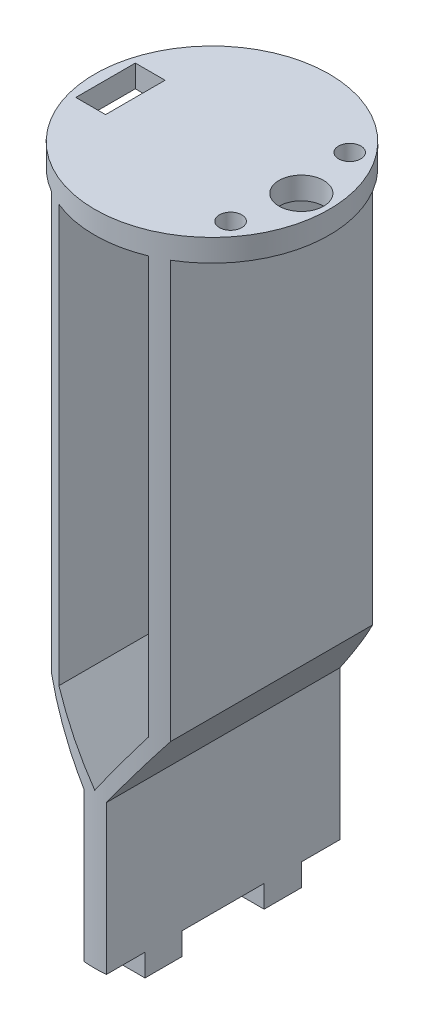
ISO-10303-21;
HEADER;
FILE_DESCRIPTION(('STEP AP214'),'2;1');
FILE_NAME('part.step','',(''),(''),'','','');
FILE_SCHEMA(('AUTOMOTIVE_DESIGN { 1 0 10303 214 1 1 1 1 }'));
ENDSEC;
DATA;
#1=APPLICATION_CONTEXT('core data for automotive mechanical design processes');
#2=APPLICATION_PROTOCOL_DEFINITION('international standard','automotive_design',2000,#1);
#3=PRODUCT_CONTEXT('',#1,'mechanical');
#4=PRODUCT('Part','Part','',(#3));
#5=PRODUCT_RELATED_PRODUCT_CATEGORY('part','',(#4));
#6=PRODUCT_DEFINITION_FORMATION('','',#4);
#7=PRODUCT_DEFINITION_CONTEXT('part definition',#1,'design');
#8=PRODUCT_DEFINITION('design','',#6,#7);
#9=PRODUCT_DEFINITION_SHAPE('','',#8);
#10=(LENGTH_UNIT() NAMED_UNIT(*) SI_UNIT(.MILLI.,.METRE.));
#11=(NAMED_UNIT(*) PLANE_ANGLE_UNIT() SI_UNIT($,.RADIAN.));
#12=(NAMED_UNIT(*) SI_UNIT($,.STERADIAN.) SOLID_ANGLE_UNIT());
#13=UNCERTAINTY_MEASURE_WITH_UNIT(LENGTH_MEASURE(1.E-05),#10,'distance_accuracy_value','');
#14=(GEOMETRIC_REPRESENTATION_CONTEXT(3) GLOBAL_UNCERTAINTY_ASSIGNED_CONTEXT((#13)) GLOBAL_UNIT_ASSIGNED_CONTEXT((#10,
#11,#12)) REPRESENTATION_CONTEXT('',''));
#15=CARTESIAN_POINT('',(0.,0.,0.));
#16=DIRECTION('',(0.,0.,1.));
#17=DIRECTION('',(1.,0.,0.));
#18=AXIS2_PLACEMENT_3D('',#15,#16,#17);
#19=CARTESIAN_POINT('',(0.,-20.,33.));
#20=DIRECTION('',(0.,1.,0.));
#21=DIRECTION('',(0.,0.,1.));
#22=AXIS2_PLACEMENT_3D('',#19,#20,#21);
#23=PLANE('',#22);
#24=DIRECTION('',(0.,0.,-1.));
#25=VECTOR('',#24,1.);
#26=CARTESIAN_POINT('',(0.,-20.,33.));
#27=LINE('',#26,#25);
#28=CARTESIAN_POINT('',(0.,-20.,6.));
#29=VERTEX_POINT('',#28);
#30=CARTESIAN_POINT('',(0.,-20.,0.821591279724847));
#31=VERTEX_POINT('',#30);
#32=EDGE_CURVE('E269',#29,#31,#27,.T.);
#33=ORIENTED_EDGE('',*,*,#32,.T.);
#34=CARTESIAN_POINT('',(1.5,-20.,16.5));
#35=DIRECTION('',(0.,1.,0.));
#36=DIRECTION('',(0.,0.,1.));
#37=AXIS2_PLACEMENT_3D('',#34,#35,#36);
#38=CIRCLE('',#37,15.75);
#39=CARTESIAN_POINT('',(3.,-20.,0.821591279724844));
#40=VERTEX_POINT('',#39);
#41=EDGE_CURVE('E489',#31,#40,#38,.F.);
#42=ORIENTED_EDGE('',*,*,#41,.T.);
#43=DIRECTION('',(0.,0.,-1.));
#44=VECTOR('',#43,1.);
#45=CARTESIAN_POINT('',(3.,-20.,33.));
#46=LINE('',#45,#44);
#47=CARTESIAN_POINT('',(3.,-20.,6.));
#48=VERTEX_POINT('',#47);
#49=EDGE_CURVE('E253',#48,#40,#46,.T.);
#50=ORIENTED_EDGE('',*,*,#49,.F.);
#51=DIRECTION('',(1.,0.,0.));
#52=VECTOR('',#51,1.);
#53=CARTESIAN_POINT('',(0.,-20.,6.));
#54=LINE('',#53,#52);
#55=EDGE_CURVE('E453',#29,#48,#54,.T.);
#56=ORIENTED_EDGE('',*,*,#55,.F.);
#57=EDGE_LOOP('',(#33,#42,#50,#56));
#58=FACE_BOUND('',#57,.T.);
#59=ADVANCED_FACE('F49',(#58),#23,.F.);
#60=DIRECTION('',(-1.,0.,0.));
#61=VECTOR('',#60,1.);
#62=CARTESIAN_POINT('',(0.,-20.,11.));
#63=LINE('',#62,#61);
#64=CARTESIAN_POINT('',(3.,-20.,11.));
#65=VERTEX_POINT('',#64);
#66=CARTESIAN_POINT('',(0.,-20.,11.));
#67=VERTEX_POINT('',#66);
#68=EDGE_CURVE('E295',#65,#67,#63,.T.);
#69=ORIENTED_EDGE('',*,*,#68,.F.);
#70=CARTESIAN_POINT('',(3.,-20.,22.));
#71=VERTEX_POINT('',#70);
#72=EDGE_CURVE('E260',#71,#65,#46,.T.);
#73=ORIENTED_EDGE('',*,*,#72,.F.);
#74=DIRECTION('',(1.,0.,0.));
#75=VECTOR('',#74,1.);
#76=CARTESIAN_POINT('',(3.,-20.,22.));
#77=LINE('',#76,#75);
#78=CARTESIAN_POINT('',(0.,-20.,22.));
#79=VERTEX_POINT('',#78);
#80=EDGE_CURVE('E293',#79,#71,#77,.T.);
#81=ORIENTED_EDGE('',*,*,#80,.F.);
#82=EDGE_CURVE('E271',#79,#67,#27,.T.);
#83=ORIENTED_EDGE('',*,*,#82,.T.);
#84=EDGE_LOOP('',(#69,#73,#81,#83));
#85=FACE_BOUND('',#84,.T.);
#86=ADVANCED_FACE('F291',(#85),#23,.F.);
#87=CARTESIAN_POINT('',(3.,-20.,32.1784087202752));
#88=VERTEX_POINT('',#87);
#89=CARTESIAN_POINT('',(3.,-20.,27.));
#90=VERTEX_POINT('',#89);
#91=EDGE_CURVE('E272',#88,#90,#46,.T.);
#92=ORIENTED_EDGE('',*,*,#91,.F.);
#93=CARTESIAN_POINT('',(1.5,-20.,16.5));
#94=DIRECTION('',(0.,1.,0.));
#95=DIRECTION('',(0.,0.,1.));
#96=AXIS2_PLACEMENT_3D('',#93,#94,#95);
#97=CIRCLE('',#96,15.75);
#98=CARTESIAN_POINT('',(0.,-20.,32.1784087202752));
#99=VERTEX_POINT('',#98);
#100=EDGE_CURVE('E414',#88,#99,#97,.F.);
#101=ORIENTED_EDGE('',*,*,#100,.T.);
#102=CARTESIAN_POINT('',(0.,-20.,27.));
#103=VERTEX_POINT('',#102);
#104=EDGE_CURVE('E53',#99,#103,#27,.T.);
#105=ORIENTED_EDGE('',*,*,#104,.T.);
#106=DIRECTION('',(-1.,0.,0.));
#107=VECTOR('',#106,1.);
#108=CARTESIAN_POINT('',(3.,-20.,27.));
#109=LINE('',#108,#107);
#110=EDGE_CURVE('E303',#90,#103,#109,.T.);
#111=ORIENTED_EDGE('',*,*,#110,.F.);
#112=EDGE_LOOP('',(#92,#101,#105,#111));
#113=FACE_BOUND('',#112,.T.);
#114=ADVANCED_FACE('F400',(#113),#23,.F.);
#115=CARTESIAN_POINT('',(-6.50000000000001,0.,33.));
#116=DIRECTION('',(1.,0.,0.));
#117=DIRECTION('',(0.,0.,-1.));
#118=AXIS2_PLACEMENT_3D('',#115,#116,#117);
#119=PLANE('',#118);
#120=DIRECTION('',(0.,0.,-1.));
#121=VECTOR('',#120,1.);
#122=CARTESIAN_POINT('',(-6.50000000000001,9.28571428571426,33.));
#123=LINE('',#122,#121);
#124=CARTESIAN_POINT('',(-6.50000000000001,9.28571428571426,30.0669635512151));
#125=VERTEX_POINT('',#124);
#126=CARTESIAN_POINT('',(-6.50000000000001,9.28571428571426,2.93303644878487));
#127=VERTEX_POINT('',#126);
#128=EDGE_CURVE('E59',#125,#127,#123,.T.);
#129=ORIENTED_EDGE('',*,*,#128,.F.);
#130=DIRECTION('',(0.,-1.,0.));
#131=VECTOR('',#130,1.);
#132=CARTESIAN_POINT('',(-6.50000000000001,98.2857142857142,30.0669635512151));
#133=LINE('',#132,#131);
#134=CARTESIAN_POINT('',(-6.50000000000001,65.2857142857142,30.0669635512151));
#135=VERTEX_POINT('',#134);
#136=EDGE_CURVE('E220',#125,#135,#133,.F.);
#137=ORIENTED_EDGE('',*,*,#136,.T.);
#138=DIRECTION('',(0.,0.,1.));
#139=VECTOR('',#138,1.);
#140=CARTESIAN_POINT('',(-6.50000000000001,65.2857142857142,33.));
#141=LINE('',#140,#139);
#142=CARTESIAN_POINT('',(-6.50000000000001,65.2857142857142,2.93303644878487));
#143=VERTEX_POINT('',#142);
#144=EDGE_CURVE('E230',#143,#135,#141,.T.);
#145=ORIENTED_EDGE('',*,*,#144,.F.);
#146=DIRECTION('',(0.,-1.,0.));
#147=VECTOR('',#146,1.);
#148=CARTESIAN_POINT('',(-6.50000000000001,98.2857142857142,2.93303644878487));
#149=LINE('',#148,#147);
#150=EDGE_CURVE('E223',#143,#127,#149,.T.);
#151=ORIENTED_EDGE('',*,*,#150,.T.);
#152=EDGE_LOOP('',(#129,#137,#145,#151));
#153=FACE_BOUND('',#152,.T.);
#154=ADVANCED_FACE('F229',(#153),#119,.F.);
#155=CARTESIAN_POINT('',(0.,0.,33.));
#156=DIRECTION('',(0.819231920519039,0.57346234436333,0.));
#157=DIRECTION('',(-0.57346234436333,0.819231920519039,0.));
#158=AXIS2_PLACEMENT_3D('',#155,#156,#157);
#159=PLANE('',#158);
#160=DIRECTION('',(0.,0.,-1.));
#161=VECTOR('',#160,1.);
#162=CARTESIAN_POINT('',(0.,0.,33.));
#163=LINE('',#162,#161);
#164=CARTESIAN_POINT('',(0.,0.,32.1784087202752));
#165=VERTEX_POINT('',#164);
#166=CARTESIAN_POINT('',(0.,0.,0.821591279724851));
#167=VERTEX_POINT('',#166);
#168=EDGE_CURVE('E425',#165,#167,#163,.T.);
#169=ORIENTED_EDGE('',*,*,#168,.F.);
#170=CARTESIAN_POINT('',(1.5,-2.14285714285714,16.5));
#171=DIRECTION('',(0.819231920519039,0.57346234436333,0.));
#172=DIRECTION('',(0.57346234436333,-0.819231920519039,0.));
#173=AXIS2_PLACEMENT_3D('',#170,#171,#172);
#174=ELLIPSE('',#173,27.4647501354007,15.75);
#175=EDGE_CURVE('E497',#165,#125,#174,.F.);
#176=ORIENTED_EDGE('',*,*,#175,.T.);
#177=ORIENTED_EDGE('',*,*,#128,.T.);
#178=EDGE_CURVE('E232',#127,#167,#174,.F.);
#179=ORIENTED_EDGE('',*,*,#178,.T.);
#180=EDGE_LOOP('',(#169,#176,#177,#179));
#181=FACE_BOUND('',#180,.T.);
#182=ADVANCED_FACE('F411',(#181),#159,.F.);
#183=CARTESIAN_POINT('',(0.,0.,33.));
#184=DIRECTION('',(1.,0.,0.));
#185=DIRECTION('',(0.,1.,0.));
#186=AXIS2_PLACEMENT_3D('',#183,#184,#185);
#187=PLANE('',#186);
#188=ORIENTED_EDGE('',*,*,#104,.F.);
#189=DIRECTION('',(0.,-1.,0.));
#190=VECTOR('',#189,1.);
#191=CARTESIAN_POINT('',(0.,98.2857142857142,32.1784087202752));
#192=LINE('',#191,#190);
#193=EDGE_CURVE('E493',#99,#165,#192,.F.);
#194=ORIENTED_EDGE('',*,*,#193,.T.);
#195=ORIENTED_EDGE('',*,*,#168,.T.);
#196=DIRECTION('',(0.,-1.,0.));
#197=VECTOR('',#196,1.);
#198=CARTESIAN_POINT('',(0.,98.2857142857142,0.821591279724847));
#199=LINE('',#198,#197);
#200=EDGE_CURVE('E495',#167,#31,#199,.T.);
#201=ORIENTED_EDGE('',*,*,#200,.T.);
#202=ORIENTED_EDGE('',*,*,#32,.F.);
#203=DIRECTION('',(0.,1.,0.));
#204=VECTOR('',#203,1.);
#205=CARTESIAN_POINT('',(0.,-23.,6.));
#206=LINE('',#205,#204);
#207=CARTESIAN_POINT('',(0.,-23.,6.));
#208=VERTEX_POINT('',#207);
#209=EDGE_CURVE('E309',#208,#29,#206,.T.);
#210=ORIENTED_EDGE('',*,*,#209,.F.);
#211=DIRECTION('',(0.,0.,-1.));
#212=VECTOR('',#211,1.);
#213=CARTESIAN_POINT('',(0.,-23.,11.));
#214=LINE('',#213,#212);
#215=CARTESIAN_POINT('',(0.,-23.,11.));
#216=VERTEX_POINT('',#215);
#217=EDGE_CURVE('E517',#216,#208,#214,.T.);
#218=ORIENTED_EDGE('',*,*,#217,.F.);
#219=DIRECTION('',(0.,1.,0.));
#220=VECTOR('',#219,1.);
#221=CARTESIAN_POINT('',(0.,-23.,11.));
#222=LINE('',#221,#220);
#223=EDGE_CURVE('E513',#216,#67,#222,.T.);
#224=ORIENTED_EDGE('',*,*,#223,.T.);
#225=ORIENTED_EDGE('',*,*,#82,.F.);
#226=DIRECTION('',(0.,1.,0.));
#227=VECTOR('',#226,1.);
#228=CARTESIAN_POINT('',(0.,-23.,22.));
#229=LINE('',#228,#227);
#230=CARTESIAN_POINT('',(0.,-23.,22.));
#231=VERTEX_POINT('',#230);
#232=EDGE_CURVE('E301',#231,#79,#229,.T.);
#233=ORIENTED_EDGE('',*,*,#232,.F.);
#234=DIRECTION('',(0.,0.,-1.));
#235=VECTOR('',#234,1.);
#236=CARTESIAN_POINT('',(0.,-23.,22.));
#237=LINE('',#236,#235);
#238=CARTESIAN_POINT('',(0.,-23.,27.));
#239=VERTEX_POINT('',#238);
#240=EDGE_CURVE('E503',#239,#231,#237,.T.);
#241=ORIENTED_EDGE('',*,*,#240,.F.);
#242=DIRECTION('',(0.,1.,0.));
#243=VECTOR('',#242,1.);
#244=CARTESIAN_POINT('',(0.,-23.,27.));
#245=LINE('',#244,#243);
#246=EDGE_CURVE('E421',#239,#103,#245,.T.);
#247=ORIENTED_EDGE('',*,*,#246,.T.);
#248=EDGE_LOOP('',(#188,#194,#195,#201,#202,#210,#218,#224,#225,#233,#241,#247));
#249=FACE_BOUND('',#248,.T.);
#250=ADVANCED_FACE('F501',(#249),#187,.F.);
#251=CARTESIAN_POINT('',(3.,0.,33.));
#252=DIRECTION('',(1.,0.,0.));
#253=DIRECTION('',(0.,1.,0.));
#254=AXIS2_PLACEMENT_3D('',#251,#252,#253);
#255=PLANE('',#254);
#256=DIRECTION('',(0.,-1.,0.));
#257=VECTOR('',#256,1.);
#258=CARTESIAN_POINT('',(2.99999999999999,98.2857142857142,32.1784087202752));
#259=LINE('',#258,#257);
#260=CARTESIAN_POINT('',(2.99999999999999,0.,32.1784087202752));
#261=VERTEX_POINT('',#260);
#262=EDGE_CURVE('E485',#88,#261,#259,.F.);
#263=ORIENTED_EDGE('',*,*,#262,.F.);
#264=ORIENTED_EDGE('',*,*,#91,.T.);
#265=DIRECTION('',(0.,1.,0.));
#266=VECTOR('',#265,1.);
#267=CARTESIAN_POINT('',(3.,-23.,27.));
#268=LINE('',#267,#266);
#269=CARTESIAN_POINT('',(3.,-23.,27.));
#270=VERTEX_POINT('',#269);
#271=EDGE_CURVE('E329',#270,#90,#268,.T.);
#272=ORIENTED_EDGE('',*,*,#271,.F.);
#273=DIRECTION('',(0.,0.,1.));
#274=VECTOR('',#273,1.);
#275=CARTESIAN_POINT('',(3.,-23.,22.));
#276=LINE('',#275,#274);
#277=CARTESIAN_POINT('',(3.,-23.,22.));
#278=VERTEX_POINT('',#277);
#279=EDGE_CURVE('E302',#278,#270,#276,.T.);
#280=ORIENTED_EDGE('',*,*,#279,.F.);
#281=DIRECTION('',(0.,1.,0.));
#282=VECTOR('',#281,1.);
#283=CARTESIAN_POINT('',(3.,-23.,22.));
#284=LINE('',#283,#282);
#285=EDGE_CURVE('E287',#278,#71,#284,.T.);
#286=ORIENTED_EDGE('',*,*,#285,.T.);
#287=ORIENTED_EDGE('',*,*,#72,.T.);
#288=DIRECTION('',(0.,1.,0.));
#289=VECTOR('',#288,1.);
#290=CARTESIAN_POINT('',(3.,-23.,11.));
#291=LINE('',#290,#289);
#292=CARTESIAN_POINT('',(3.,-23.,11.));
#293=VERTEX_POINT('',#292);
#294=EDGE_CURVE('E283',#293,#65,#291,.T.);
#295=ORIENTED_EDGE('',*,*,#294,.F.);
#296=DIRECTION('',(0.,0.,1.));
#297=VECTOR('',#296,1.);
#298=CARTESIAN_POINT('',(3.,-23.,11.));
#299=LINE('',#298,#297);
#300=CARTESIAN_POINT('',(3.,-23.,6.));
#301=VERTEX_POINT('',#300);
#302=EDGE_CURVE('E520',#301,#293,#299,.T.);
#303=ORIENTED_EDGE('',*,*,#302,.F.);
#304=DIRECTION('',(0.,1.,0.));
#305=VECTOR('',#304,1.);
#306=CARTESIAN_POINT('',(3.,-23.,6.));
#307=LINE('',#306,#305);
#308=EDGE_CURVE('E510',#301,#48,#307,.T.);
#309=ORIENTED_EDGE('',*,*,#308,.T.);
#310=ORIENTED_EDGE('',*,*,#49,.T.);
#311=DIRECTION('',(0.,-1.,0.));
#312=VECTOR('',#311,1.);
#313=CARTESIAN_POINT('',(2.99999999999999,98.2857142857142,0.821591279724844));
#314=LINE('',#313,#312);
#315=CARTESIAN_POINT('',(2.99999999999999,0.,0.821591279724844));
#316=VERTEX_POINT('',#315);
#317=EDGE_CURVE('E487',#316,#40,#314,.T.);
#318=ORIENTED_EDGE('',*,*,#317,.F.);
#319=DIRECTION('',(0.,0.,-1.));
#320=VECTOR('',#319,1.);
#321=CARTESIAN_POINT('',(3.,0.,33.));
#322=LINE('',#321,#320);
#323=EDGE_CURVE('E249',#261,#316,#322,.T.);
#324=ORIENTED_EDGE('',*,*,#323,.F.);
#325=EDGE_LOOP('',(#263,#264,#272,#280,#286,#287,#295,#303,#309,#310,#318,#324));
#326=FACE_BOUND('',#325,.T.);
#327=ADVANCED_FACE('F281',(#326),#255,.T.);
#328=CARTESIAN_POINT('',(2.01342281879194,-1.40939597315436,33.));
#329=DIRECTION('',(-0.81923192051904,0.573462344363329,0.));
#330=DIRECTION('',(-0.573462344363329,-0.81923192051904,0.));
#331=AXIS2_PLACEMENT_3D('',#328,#329,#330);
#332=PLANE('',#331);
#333=ORIENTED_EDGE('',*,*,#323,.T.);
#334=CARTESIAN_POINT('',(1.5,-2.14285714285713,16.5));
#335=DIRECTION('',(-0.81923192051904,0.573462344363329,0.));
#336=DIRECTION('',(-0.573462344363329,-0.81923192051904,0.));
#337=AXIS2_PLACEMENT_3D('',#334,#335,#336);
#338=ELLIPSE('',#337,27.4647501354008,15.75);
#339=CARTESIAN_POINT('',(9.49999999999999,9.28571428571426,2.93303644878486));
#340=VERTEX_POINT('',#339);
#341=EDGE_CURVE('E481',#316,#340,#338,.F.);
#342=ORIENTED_EDGE('',*,*,#341,.T.);
#343=DIRECTION('',(0.,0.,-1.));
#344=VECTOR('',#343,1.);
#345=CARTESIAN_POINT('',(9.49999999999999,9.28571428571426,33.));
#346=LINE('',#345,#344);
#347=CARTESIAN_POINT('',(9.49999999999999,9.28571428571426,30.0669635512151));
#348=VERTEX_POINT('',#347);
#349=EDGE_CURVE('E246',#348,#340,#346,.T.);
#350=ORIENTED_EDGE('',*,*,#349,.F.);
#351=EDGE_CURVE('E482',#348,#261,#338,.F.);
#352=ORIENTED_EDGE('',*,*,#351,.T.);
#353=EDGE_LOOP('',(#333,#342,#350,#352));
#354=FACE_BOUND('',#353,.T.);
#355=ADVANCED_FACE('F593',(#354),#332,.F.);
#356=CARTESIAN_POINT('',(9.49999999999999,0.,33.));
#357=DIRECTION('',(-1.,0.,0.));
#358=DIRECTION('',(0.,0.,1.));
#359=AXIS2_PLACEMENT_3D('',#356,#357,#358);
#360=PLANE('',#359);
#361=ORIENTED_EDGE('',*,*,#349,.T.);
#362=DIRECTION('',(0.,-1.,0.));
#363=VECTOR('',#362,1.);
#364=CARTESIAN_POINT('',(9.49999999999999,98.2857142857142,2.93303644878486));
#365=LINE('',#364,#363);
#366=CARTESIAN_POINT('',(9.49999999999999,65.2857142857142,2.93303644878486));
#367=VERTEX_POINT('',#366);
#368=EDGE_CURVE('E475',#340,#367,#365,.F.);
#369=ORIENTED_EDGE('',*,*,#368,.T.);
#370=DIRECTION('',(0.,0.,-1.));
#371=VECTOR('',#370,1.);
#372=CARTESIAN_POINT('',(9.49999999999999,65.2857142857142,33.));
#373=LINE('',#372,#371);
#374=CARTESIAN_POINT('',(9.49999999999999,65.2857142857142,30.0669635512151));
#375=VERTEX_POINT('',#374);
#376=EDGE_CURVE('E236',#375,#367,#373,.T.);
#377=ORIENTED_EDGE('',*,*,#376,.F.);
#378=DIRECTION('',(0.,-1.,0.));
#379=VECTOR('',#378,1.);
#380=CARTESIAN_POINT('',(9.49999999999999,98.2857142857142,30.0669635512151));
#381=LINE('',#380,#379);
#382=EDGE_CURVE('E478',#375,#348,#381,.T.);
#383=ORIENTED_EDGE('',*,*,#382,.T.);
#384=EDGE_LOOP('',(#361,#369,#377,#383));
#385=FACE_BOUND('',#384,.T.);
#386=ADVANCED_FACE('F588',(#385),#360,.F.);
#387=CARTESIAN_POINT('',(0.,68.2857142857142,33.));
#388=DIRECTION('',(0.,-1.,0.));
#389=DIRECTION('',(0.,0.,-1.));
#390=AXIS2_PLACEMENT_3D('',#387,#388,#389);
#391=PLANE('',#390);
#392=CARTESIAN_POINT('',(1.5,68.2857142857142,16.5));
#393=DIRECTION('',(0.,-1.,0.));
#394=DIRECTION('',(0.,0.,-1.));
#395=AXIS2_PLACEMENT_3D('',#392,#393,#394);
#396=CIRCLE('',#395,15.75);
#397=CARTESIAN_POINT('',(1.5,68.2857142857142,0.750000000000001));
#398=VERTEX_POINT('',#397);
#399=EDGE_CURVE('E469',#398,#398,#396,.F.);
#400=ORIENTED_EDGE('',*,*,#399,.T.);
#401=EDGE_LOOP('',(#400));
#402=FACE_BOUND('',#401,.T.);
#403=CARTESIAN_POINT('',(12.,68.2857142857142,24.5));
#404=DIRECTION('',(0.,-1.,0.));
#405=DIRECTION('',(0.,0.,1.));
#406=AXIS2_PLACEMENT_3D('',#403,#404,#405);
#407=CIRCLE('',#406,1.5);
#408=CARTESIAN_POINT('',(12.,68.2857142857142,26.));
#409=VERTEX_POINT('',#408);
#410=EDGE_CURVE('E322',#409,#409,#407,.T.);
#411=ORIENTED_EDGE('',*,*,#410,.T.);
#412=EDGE_LOOP('',(#411));
#413=FACE_BOUND('',#412,.T.);
#414=CARTESIAN_POINT('',(12.,68.2857142857142,8.5));
#415=DIRECTION('',(0.,-1.,0.));
#416=DIRECTION('',(0.,0.,-1.));
#417=AXIS2_PLACEMENT_3D('',#414,#415,#416);
#418=CIRCLE('',#417,1.5);
#419=CARTESIAN_POINT('',(12.,68.2857142857142,7.));
#420=VERTEX_POINT('',#419);
#421=EDGE_CURVE('E330',#420,#420,#418,.T.);
#422=ORIENTED_EDGE('',*,*,#421,.T.);
#423=EDGE_LOOP('',(#422));
#424=FACE_BOUND('',#423,.T.);
#425=CARTESIAN_POINT('',(13.5,68.2857142857142,16.5));
#426=DIRECTION('',(0.,-1.,0.));
#427=DIRECTION('',(0.,0.,-1.));
#428=AXIS2_PLACEMENT_3D('',#425,#426,#427);
#429=CIRCLE('',#428,3.);
#430=CARTESIAN_POINT('',(13.5,68.2857142857142,13.5));
#431=VERTEX_POINT('',#430);
#432=EDGE_CURVE('E336',#431,#431,#429,.T.);
#433=ORIENTED_EDGE('',*,*,#432,.T.);
#434=EDGE_LOOP('',(#433));
#435=FACE_BOUND('',#434,.T.);
#436=DIRECTION('',(-1.,0.,0.));
#437=VECTOR('',#436,1.);
#438=CARTESIAN_POINT('',(-12.8,68.2857142857142,20.5));
#439=LINE('',#438,#437);
#440=CARTESIAN_POINT('',(-8.80000000000001,68.2857142857142,20.5));
#441=VERTEX_POINT('',#440);
#442=CARTESIAN_POINT('',(-12.8,68.2857142857142,20.5));
#443=VERTEX_POINT('',#442);
#444=EDGE_CURVE('E352',#441,#443,#439,.T.);
#445=ORIENTED_EDGE('',*,*,#444,.T.);
#446=DIRECTION('',(0.,0.,-1.));
#447=VECTOR('',#446,1.);
#448=CARTESIAN_POINT('',(-12.8,68.2857142857142,12.5));
#449=LINE('',#448,#447);
#450=CARTESIAN_POINT('',(-12.8,68.2857142857142,12.5));
#451=VERTEX_POINT('',#450);
#452=EDGE_CURVE('E342',#443,#451,#449,.T.);
#453=ORIENTED_EDGE('',*,*,#452,.T.);
#454=DIRECTION('',(1.,0.,0.));
#455=VECTOR('',#454,1.);
#456=CARTESIAN_POINT('',(-8.80000000000001,68.2857142857142,12.5));
#457=LINE('',#456,#455);
#458=CARTESIAN_POINT('',(-8.80000000000001,68.2857142857142,12.5));
#459=VERTEX_POINT('',#458);
#460=EDGE_CURVE('E345',#451,#459,#457,.T.);
#461=ORIENTED_EDGE('',*,*,#460,.T.);
#462=DIRECTION('',(0.,0.,1.));
#463=VECTOR('',#462,1.);
#464=CARTESIAN_POINT('',(-8.80000000000001,68.2857142857142,20.5));
#465=LINE('',#464,#463);
#466=EDGE_CURVE('E349',#459,#441,#465,.T.);
#467=ORIENTED_EDGE('',*,*,#466,.T.);
#468=EDGE_LOOP('',(#445,#453,#461,#467));
#469=FACE_BOUND('',#468,.T.);
#470=ADVANCED_FACE('F386',(#402,#413,#424,#435,#469),#391,.F.);
#471=CARTESIAN_POINT('',(1.5,65.2857142857142,16.5));
#472=DIRECTION('',(0.,1.,0.));
#473=DIRECTION('',(0.,0.,1.));
#474=AXIS2_PLACEMENT_3D('',#471,#472,#473);
#475=PLANE('',#474);
#476=CARTESIAN_POINT('',(12.,65.2857142857142,24.5));
#477=DIRECTION('',(0.,-1.,0.));
#478=DIRECTION('',(0.,0.,1.));
#479=AXIS2_PLACEMENT_3D('',#476,#477,#478);
#480=CIRCLE('',#479,1.5);
#481=CARTESIAN_POINT('',(12.,65.2857142857142,26.));
#482=VERTEX_POINT('',#481);
#483=EDGE_CURVE('E326',#482,#482,#480,.T.);
#484=ORIENTED_EDGE('',*,*,#483,.F.);
#485=EDGE_LOOP('',(#484));
#486=FACE_BOUND('',#485,.T.);
#487=CARTESIAN_POINT('',(12.,65.2857142857142,8.5));
#488=DIRECTION('',(0.,-1.,0.));
#489=DIRECTION('',(0.,0.,-1.));
#490=AXIS2_PLACEMENT_3D('',#487,#488,#489);
#491=CIRCLE('',#490,1.5);
#492=CARTESIAN_POINT('',(12.,65.2857142857142,7.));
#493=VERTEX_POINT('',#492);
#494=EDGE_CURVE('E325',#493,#493,#491,.T.);
#495=ORIENTED_EDGE('',*,*,#494,.F.);
#496=EDGE_LOOP('',(#495));
#497=FACE_BOUND('',#496,.T.);
#498=CARTESIAN_POINT('',(13.5,65.2857142857142,16.5));
#499=DIRECTION('',(0.,-1.,0.));
#500=DIRECTION('',(0.,0.,-1.));
#501=AXIS2_PLACEMENT_3D('',#498,#499,#500);
#502=CIRCLE('',#501,3.);
#503=CARTESIAN_POINT('',(13.5,65.2857142857142,13.5));
#504=VERTEX_POINT('',#503);
#505=EDGE_CURVE('E333',#504,#504,#502,.T.);
#506=ORIENTED_EDGE('',*,*,#505,.F.);
#507=EDGE_LOOP('',(#506));
#508=FACE_BOUND('',#507,.T.);
#509=ORIENTED_EDGE('',*,*,#376,.T.);
#510=CARTESIAN_POINT('',(1.5,65.2857142857142,16.5));
#511=DIRECTION('',(0.,1.,0.));
#512=DIRECTION('',(0.,0.,1.));
#513=AXIS2_PLACEMENT_3D('',#510,#511,#512);
#514=CIRCLE('',#513,15.75);
#515=EDGE_CURVE('E472',#367,#375,#514,.F.);
#516=ORIENTED_EDGE('',*,*,#515,.T.);
#517=EDGE_LOOP('',(#509,#516));
#518=FACE_BOUND('',#517,.T.);
#519=ADVANCED_FACE('F581',(#486,#497,#508,#518),#475,.F.);
#520=DIRECTION('',(1.,0.,0.));
#521=VECTOR('',#520,1.);
#522=CARTESIAN_POINT('',(-8.80000000000001,65.2857142857142,12.5));
#523=LINE('',#522,#521);
#524=CARTESIAN_POINT('',(-12.8,65.2857142857142,12.5));
#525=VERTEX_POINT('',#524);
#526=CARTESIAN_POINT('',(-8.80000000000001,65.2857142857142,12.5));
#527=VERTEX_POINT('',#526);
#528=EDGE_CURVE('E339',#525,#527,#523,.T.);
#529=ORIENTED_EDGE('',*,*,#528,.F.);
#530=DIRECTION('',(0.,0.,-1.));
#531=VECTOR('',#530,1.);
#532=CARTESIAN_POINT('',(-12.8,65.2857142857142,16.5));
#533=LINE('',#532,#531);
#534=CARTESIAN_POINT('',(-12.8,65.2857142857142,20.5));
#535=VERTEX_POINT('',#534);
#536=EDGE_CURVE('E346',#535,#525,#533,.T.);
#537=ORIENTED_EDGE('',*,*,#536,.F.);
#538=DIRECTION('',(-1.,0.,0.));
#539=VECTOR('',#538,1.);
#540=CARTESIAN_POINT('',(-12.8,65.2857142857142,20.5));
#541=LINE('',#540,#539);
#542=CARTESIAN_POINT('',(-8.80000000000001,65.2857142857142,20.5));
#543=VERTEX_POINT('',#542);
#544=EDGE_CURVE('E361',#543,#535,#541,.T.);
#545=ORIENTED_EDGE('',*,*,#544,.F.);
#546=DIRECTION('',(0.,0.,1.));
#547=VECTOR('',#546,1.);
#548=CARTESIAN_POINT('',(-8.80000000000001,65.2857142857142,20.5));
#549=LINE('',#548,#547);
#550=EDGE_CURVE('E358',#527,#543,#549,.T.);
#551=ORIENTED_EDGE('',*,*,#550,.F.);
#552=EDGE_LOOP('',(#529,#537,#545,#551));
#553=FACE_BOUND('',#552,.T.);
#554=ORIENTED_EDGE('',*,*,#144,.T.);
#555=CARTESIAN_POINT('',(1.5,65.2857142857142,16.5));
#556=DIRECTION('',(0.,1.,0.));
#557=DIRECTION('',(0.,0.,1.));
#558=AXIS2_PLACEMENT_3D('',#555,#556,#557);
#559=CIRCLE('',#558,15.75);
#560=EDGE_CURVE('E12',#135,#143,#559,.F.);
#561=ORIENTED_EDGE('',*,*,#560,.T.);
#562=EDGE_LOOP('',(#554,#561));
#563=FACE_BOUND('',#562,.T.);
#564=ADVANCED_FACE('F234',(#553,#563),#475,.F.);
#565=CARTESIAN_POINT('',(-12.8,68.2857142857142,16.5));
#566=DIRECTION('',(-1.,0.,0.));
#567=DIRECTION('',(0.,0.,1.));
#568=AXIS2_PLACEMENT_3D('',#565,#566,#567);
#569=PLANE('',#568);
#570=ORIENTED_EDGE('',*,*,#536,.T.);
#571=DIRECTION('',(0.,-1.,0.));
#572=VECTOR('',#571,1.);
#573=CARTESIAN_POINT('',(-12.8,68.2857142857142,12.5));
#574=LINE('',#573,#572);
#575=EDGE_CURVE('E355',#451,#525,#574,.T.);
#576=ORIENTED_EDGE('',*,*,#575,.F.);
#577=ORIENTED_EDGE('',*,*,#452,.F.);
#578=DIRECTION('',(0.,-1.,0.));
#579=VECTOR('',#578,1.);
#580=CARTESIAN_POINT('',(-12.8,68.2857142857142,20.5));
#581=LINE('',#580,#579);
#582=EDGE_CURVE('E242',#443,#535,#581,.T.);
#583=ORIENTED_EDGE('',*,*,#582,.T.);
#584=EDGE_LOOP('',(#570,#576,#577,#583));
#585=FACE_BOUND('',#584,.T.);
#586=ADVANCED_FACE('F378',(#585),#569,.F.);
#587=CARTESIAN_POINT('',(-12.8,68.2857142857142,20.5));
#588=DIRECTION('',(0.,0.,1.));
#589=DIRECTION('',(1.,0.,0.));
#590=AXIS2_PLACEMENT_3D('',#587,#588,#589);
#591=PLANE('',#590);
#592=ORIENTED_EDGE('',*,*,#544,.T.);
#593=ORIENTED_EDGE('',*,*,#582,.F.);
#594=ORIENTED_EDGE('',*,*,#444,.F.);
#595=DIRECTION('',(0.,-1.,0.));
#596=VECTOR('',#595,1.);
#597=CARTESIAN_POINT('',(-8.80000000000001,68.2857142857142,20.5));
#598=LINE('',#597,#596);
#599=EDGE_CURVE('E367',#441,#543,#598,.T.);
#600=ORIENTED_EDGE('',*,*,#599,.T.);
#601=EDGE_LOOP('',(#592,#593,#594,#600));
#602=FACE_BOUND('',#601,.T.);
#603=ADVANCED_FACE('F388',(#602),#591,.F.);
#604=CARTESIAN_POINT('',(-8.80000000000001,68.2857142857142,20.5));
#605=DIRECTION('',(1.,0.,0.));
#606=DIRECTION('',(0.,0.,-1.));
#607=AXIS2_PLACEMENT_3D('',#604,#605,#606);
#608=PLANE('',#607);
#609=ORIENTED_EDGE('',*,*,#550,.T.);
#610=ORIENTED_EDGE('',*,*,#599,.F.);
#611=ORIENTED_EDGE('',*,*,#466,.F.);
#612=DIRECTION('',(0.,-1.,0.));
#613=VECTOR('',#612,1.);
#614=CARTESIAN_POINT('',(-8.80000000000001,68.2857142857142,12.5));
#615=LINE('',#614,#613);
#616=EDGE_CURVE('E369',#459,#527,#615,.T.);
#617=ORIENTED_EDGE('',*,*,#616,.T.);
#618=EDGE_LOOP('',(#609,#610,#611,#617));
#619=FACE_BOUND('',#618,.T.);
#620=ADVANCED_FACE('F383',(#619),#608,.F.);
#621=CARTESIAN_POINT('',(-8.80000000000001,68.2857142857142,12.5));
#622=DIRECTION('',(0.,0.,-1.));
#623=DIRECTION('',(-1.,0.,0.));
#624=AXIS2_PLACEMENT_3D('',#621,#622,#623);
#625=PLANE('',#624);
#626=ORIENTED_EDGE('',*,*,#528,.T.);
#627=ORIENTED_EDGE('',*,*,#616,.F.);
#628=ORIENTED_EDGE('',*,*,#460,.F.);
#629=ORIENTED_EDGE('',*,*,#575,.T.);
#630=EDGE_LOOP('',(#626,#627,#628,#629));
#631=FACE_BOUND('',#630,.T.);
#632=ADVANCED_FACE('F372',(#631),#625,.F.);
#633=CARTESIAN_POINT('',(13.5,68.2857142857142,16.5));
#634=DIRECTION('',(0.,-1.,0.));
#635=DIRECTION('',(0.,0.,-1.));
#636=AXIS2_PLACEMENT_3D('',#633,#634,#635);
#637=CYLINDRICAL_SURFACE('',#636,3.);
#638=ORIENTED_EDGE('',*,*,#432,.F.);
#639=EDGE_LOOP('',(#638));
#640=FACE_BOUND('',#639,.T.);
#641=ORIENTED_EDGE('',*,*,#505,.T.);
#642=EDGE_LOOP('',(#641));
#643=FACE_BOUND('',#642,.T.);
#644=ADVANCED_FACE('F569',(#640,#643),#637,.F.);
#645=CARTESIAN_POINT('',(12.,68.2857142857142,8.5));
#646=DIRECTION('',(0.,-1.,0.));
#647=DIRECTION('',(0.,0.,-1.));
#648=AXIS2_PLACEMENT_3D('',#645,#646,#647);
#649=CYLINDRICAL_SURFACE('',#648,1.5);
#650=ORIENTED_EDGE('',*,*,#421,.F.);
#651=EDGE_LOOP('',(#650));
#652=FACE_BOUND('',#651,.T.);
#653=ORIENTED_EDGE('',*,*,#494,.T.);
#654=EDGE_LOOP('',(#653));
#655=FACE_BOUND('',#654,.T.);
#656=ADVANCED_FACE('F565',(#652,#655),#649,.F.);
#657=CARTESIAN_POINT('',(12.,68.2857142857142,24.5));
#658=DIRECTION('',(0.,-1.,0.));
#659=DIRECTION('',(0.,0.,-1.));
#660=AXIS2_PLACEMENT_3D('',#657,#658,#659);
#661=CYLINDRICAL_SURFACE('',#660,1.5);
#662=ORIENTED_EDGE('',*,*,#410,.F.);
#663=EDGE_LOOP('',(#662));
#664=FACE_BOUND('',#663,.T.);
#665=ORIENTED_EDGE('',*,*,#483,.T.);
#666=EDGE_LOOP('',(#665));
#667=FACE_BOUND('',#666,.T.);
#668=ADVANCED_FACE('F562',(#664,#667),#661,.F.);
#669=CARTESIAN_POINT('',(3.,-23.,27.));
#670=DIRECTION('',(0.,0.,-1.));
#671=DIRECTION('',(-1.,0.,0.));
#672=AXIS2_PLACEMENT_3D('',#669,#670,#671);
#673=PLANE('',#672);
#674=ORIENTED_EDGE('',*,*,#110,.T.);
#675=ORIENTED_EDGE('',*,*,#246,.F.);
#676=DIRECTION('',(-1.,0.,0.));
#677=VECTOR('',#676,1.);
#678=CARTESIAN_POINT('',(3.,-23.,27.));
#679=LINE('',#678,#677);
#680=EDGE_CURVE('E306',#270,#239,#679,.T.);
#681=ORIENTED_EDGE('',*,*,#680,.F.);
#682=ORIENTED_EDGE('',*,*,#271,.T.);
#683=EDGE_LOOP('',(#674,#675,#681,#682));
#684=FACE_BOUND('',#683,.T.);
#685=ADVANCED_FACE('F420',(#684),#673,.F.);
#686=CARTESIAN_POINT('',(3.,-23.,22.));
#687=DIRECTION('',(0.,0.,1.));
#688=DIRECTION('',(1.,0.,0.));
#689=AXIS2_PLACEMENT_3D('',#686,#687,#688);
#690=PLANE('',#689);
#691=ORIENTED_EDGE('',*,*,#80,.T.);
#692=ORIENTED_EDGE('',*,*,#285,.F.);
#693=DIRECTION('',(1.,0.,0.));
#694=VECTOR('',#693,1.);
#695=CARTESIAN_POINT('',(3.,-23.,22.));
#696=LINE('',#695,#694);
#697=EDGE_CURVE('E505',#231,#278,#696,.T.);
#698=ORIENTED_EDGE('',*,*,#697,.F.);
#699=ORIENTED_EDGE('',*,*,#232,.T.);
#700=EDGE_LOOP('',(#691,#692,#698,#699));
#701=FACE_BOUND('',#700,.T.);
#702=ADVANCED_FACE('F298',(#701),#690,.F.);
#703=CARTESIAN_POINT('',(0.,-23.,0.));
#704=DIRECTION('',(0.,-1.,0.));
#705=DIRECTION('',(0.,0.,-1.));
#706=AXIS2_PLACEMENT_3D('',#703,#704,#705);
#707=PLANE('',#706);
#708=ORIENTED_EDGE('',*,*,#279,.T.);
#709=ORIENTED_EDGE('',*,*,#680,.T.);
#710=ORIENTED_EDGE('',*,*,#240,.T.);
#711=ORIENTED_EDGE('',*,*,#697,.T.);
#712=EDGE_LOOP('',(#708,#709,#710,#711));
#713=FACE_BOUND('',#712,.T.);
#714=ADVANCED_FACE('F554',(#713),#707,.T.);
#715=CARTESIAN_POINT('',(0.,-23.,6.));
#716=DIRECTION('',(0.,0.,1.));
#717=DIRECTION('',(1.,0.,0.));
#718=AXIS2_PLACEMENT_3D('',#715,#716,#717);
#719=PLANE('',#718);
#720=ORIENTED_EDGE('',*,*,#55,.T.);
#721=ORIENTED_EDGE('',*,*,#308,.F.);
#722=DIRECTION('',(1.,0.,0.));
#723=VECTOR('',#722,1.);
#724=CARTESIAN_POINT('',(0.,-23.,6.));
#725=LINE('',#724,#723);
#726=EDGE_CURVE('E522',#208,#301,#725,.T.);
#727=ORIENTED_EDGE('',*,*,#726,.F.);
#728=ORIENTED_EDGE('',*,*,#209,.T.);
#729=EDGE_LOOP('',(#720,#721,#727,#728));
#730=FACE_BOUND('',#729,.T.);
#731=ADVANCED_FACE('F550',(#730),#719,.F.);
#732=CARTESIAN_POINT('',(0.,-23.,11.));
#733=DIRECTION('',(0.,0.,-1.));
#734=DIRECTION('',(-1.,0.,0.));
#735=AXIS2_PLACEMENT_3D('',#732,#733,#734);
#736=PLANE('',#735);
#737=ORIENTED_EDGE('',*,*,#68,.T.);
#738=ORIENTED_EDGE('',*,*,#223,.F.);
#739=DIRECTION('',(-1.,0.,0.));
#740=VECTOR('',#739,1.);
#741=CARTESIAN_POINT('',(0.,-23.,11.));
#742=LINE('',#741,#740);
#743=EDGE_CURVE('E516',#293,#216,#742,.T.);
#744=ORIENTED_EDGE('',*,*,#743,.F.);
#745=ORIENTED_EDGE('',*,*,#294,.T.);
#746=EDGE_LOOP('',(#737,#738,#744,#745));
#747=FACE_BOUND('',#746,.T.);
#748=ADVANCED_FACE('F544',(#747),#736,.F.);
#749=CARTESIAN_POINT('',(0.,-23.,0.));
#750=DIRECTION('',(0.,-1.,0.));
#751=DIRECTION('',(0.,0.,-1.));
#752=AXIS2_PLACEMENT_3D('',#749,#750,#751);
#753=PLANE('',#752);
#754=ORIENTED_EDGE('',*,*,#217,.T.);
#755=ORIENTED_EDGE('',*,*,#726,.T.);
#756=ORIENTED_EDGE('',*,*,#302,.T.);
#757=ORIENTED_EDGE('',*,*,#743,.T.);
#758=EDGE_LOOP('',(#754,#755,#756,#757));
#759=FACE_BOUND('',#758,.T.);
#760=ADVANCED_FACE('F537',(#759),#753,.T.);
#761=CARTESIAN_POINT('',(1.5,98.2857142857142,16.5));
#762=DIRECTION('',(0.,-1.,0.));
#763=DIRECTION('',(0.,0.,-1.));
#764=AXIS2_PLACEMENT_3D('',#761,#762,#763);
#765=CYLINDRICAL_SURFACE('',#764,15.75);
#766=CARTESIAN_POINT('',(1.5,0.714285714285723,16.5));
#767=DIRECTION('',(-0.81923192051904,0.573462344363329,0.));
#768=DIRECTION('',(-0.573462344363329,-0.81923192051904,0.));
#769=AXIS2_PLACEMENT_3D('',#766,#767,#768);
#770=ELLIPSE('',#769,27.4647501354008,15.75);
#771=CARTESIAN_POINT('',(1.5,0.714285714285712,0.750000000000001));
#772=VERTEX_POINT('',#771);
#773=CARTESIAN_POINT('',(7.49999999999999,9.28571428571426,1.9376341207893));
#774=VERTEX_POINT('',#773);
#775=EDGE_CURVE('E75',#772,#774,#770,.F.);
#776=ORIENTED_EDGE('',*,*,#775,.T.);
#777=DIRECTION('',(0.,-1.,0.));
#778=VECTOR('',#777,1.);
#779=CARTESIAN_POINT('',(7.49999999999999,98.2857142857142,1.9376341207893));
#780=LINE('',#779,#778);
#781=CARTESIAN_POINT('',(7.49999999999999,65.2857142857142,1.9376341207893));
#782=VERTEX_POINT('',#781);
#783=EDGE_CURVE('E460',#774,#782,#780,.F.);
#784=ORIENTED_EDGE('',*,*,#783,.T.);
#785=CARTESIAN_POINT('',(1.5,65.2857142857142,16.5));
#786=DIRECTION('',(0.,-1.,0.));
#787=DIRECTION('',(0.,0.,-1.));
#788=AXIS2_PLACEMENT_3D('',#785,#786,#787);
#789=CIRCLE('',#788,15.75);
#790=CARTESIAN_POINT('',(-4.50000000000001,65.2857142857142,1.93763412078931));
#791=VERTEX_POINT('',#790);
#792=EDGE_CURVE('E461',#782,#791,#789,.F.);
#793=ORIENTED_EDGE('',*,*,#792,.T.);
#794=DIRECTION('',(0.,-1.,0.));
#795=VECTOR('',#794,1.);
#796=CARTESIAN_POINT('',(-4.50000000000001,98.2857142857142,1.93763412078931));
#797=LINE('',#796,#795);
#798=CARTESIAN_POINT('',(-4.50000000000001,9.28571428571426,1.93763412078931));
#799=VERTEX_POINT('',#798);
#800=EDGE_CURVE('E457',#791,#799,#797,.T.);
#801=ORIENTED_EDGE('',*,*,#800,.T.);
#802=CARTESIAN_POINT('',(1.5,0.714285714285709,16.5));
#803=DIRECTION('',(0.819231920519039,0.57346234436333,0.));
#804=DIRECTION('',(0.57346234436333,-0.819231920519039,0.));
#805=AXIS2_PLACEMENT_3D('',#802,#803,#804);
#806=ELLIPSE('',#805,27.4647501354007,15.75);
#807=EDGE_CURVE('E447',#799,#772,#806,.F.);
#808=ORIENTED_EDGE('',*,*,#807,.T.);
#809=EDGE_LOOP('',(#776,#784,#793,#801,#808));
#810=FACE_BOUND('',#809,.T.);
#811=CARTESIAN_POINT('',(7.49999999999999,9.28571428571426,31.0623658792107));
#812=VERTEX_POINT('',#811);
#813=CARTESIAN_POINT('',(1.5,0.714285714285712,32.25));
#814=VERTEX_POINT('',#813);
#815=EDGE_CURVE('E451',#812,#814,#770,.F.);
#816=ORIENTED_EDGE('',*,*,#815,.T.);
#817=CARTESIAN_POINT('',(-4.50000000000001,9.28571428571426,31.0623658792107));
#818=VERTEX_POINT('',#817);
#819=EDGE_CURVE('E448',#814,#818,#806,.F.);
#820=ORIENTED_EDGE('',*,*,#819,.T.);
#821=DIRECTION('',(0.,-1.,0.));
#822=VECTOR('',#821,1.);
#823=CARTESIAN_POINT('',(-4.50000000000001,98.2857142857142,31.0623658792107));
#824=LINE('',#823,#822);
#825=CARTESIAN_POINT('',(-4.50000000000001,65.2857142857142,31.0623658792107));
#826=VERTEX_POINT('',#825);
#827=EDGE_CURVE('E462',#818,#826,#824,.F.);
#828=ORIENTED_EDGE('',*,*,#827,.T.);
#829=CARTESIAN_POINT('',(7.49999999999999,65.2857142857142,31.0623658792107));
#830=VERTEX_POINT('',#829);
#831=EDGE_CURVE('E67',#826,#830,#789,.F.);
#832=ORIENTED_EDGE('',*,*,#831,.T.);
#833=DIRECTION('',(0.,-1.,0.));
#834=VECTOR('',#833,1.);
#835=CARTESIAN_POINT('',(7.49999999999999,98.2857142857142,31.0623658792107));
#836=LINE('',#835,#834);
#837=EDGE_CURVE('E467',#830,#812,#836,.T.);
#838=ORIENTED_EDGE('',*,*,#837,.T.);
#839=EDGE_LOOP('',(#816,#820,#828,#832,#838));
#840=FACE_BOUND('',#839,.T.);
#841=ORIENTED_EDGE('',*,*,#368,.F.);
#842=ORIENTED_EDGE('',*,*,#341,.F.);
#843=ORIENTED_EDGE('',*,*,#317,.T.);
#844=ORIENTED_EDGE('',*,*,#41,.F.);
#845=ORIENTED_EDGE('',*,*,#200,.F.);
#846=ORIENTED_EDGE('',*,*,#178,.F.);
#847=ORIENTED_EDGE('',*,*,#150,.F.);
#848=ORIENTED_EDGE('',*,*,#560,.F.);
#849=ORIENTED_EDGE('',*,*,#136,.F.);
#850=ORIENTED_EDGE('',*,*,#175,.F.);
#851=ORIENTED_EDGE('',*,*,#193,.F.);
#852=ORIENTED_EDGE('',*,*,#100,.F.);
#853=ORIENTED_EDGE('',*,*,#262,.T.);
#854=ORIENTED_EDGE('',*,*,#351,.F.);
#855=ORIENTED_EDGE('',*,*,#382,.F.);
#856=ORIENTED_EDGE('',*,*,#515,.F.);
#857=EDGE_LOOP('',(#841,#842,#843,#844,#845,#846,#847,#848,#849,#850,#851,#852,#853,#854,#855,#856));
#858=FACE_BOUND('',#857,.T.);
#859=ORIENTED_EDGE('',*,*,#399,.F.);
#860=EDGE_LOOP('',(#859));
#861=FACE_BOUND('',#860,.T.);
#862=ADVANCED_FACE('F218',(#810,#840,#858,#861),#765,.T.);
#863=CARTESIAN_POINT('',(7.49999999999999,0.,33.));
#864=DIRECTION('',(-1.,0.,0.));
#865=DIRECTION('',(0.,0.,1.));
#866=AXIS2_PLACEMENT_3D('',#863,#864,#865);
#867=PLANE('',#866);
#868=ORIENTED_EDGE('',*,*,#783,.F.);
#869=DIRECTION('',(0.,0.,-1.));
#870=VECTOR('',#869,1.);
#871=CARTESIAN_POINT('',(7.49999999999999,9.28571428571426,33.));
#872=LINE('',#871,#870);
#873=EDGE_CURVE('E235',#812,#774,#872,.T.);
#874=ORIENTED_EDGE('',*,*,#873,.F.);
#875=ORIENTED_EDGE('',*,*,#837,.F.);
#876=DIRECTION('',(0.,0.,-1.));
#877=VECTOR('',#876,1.);
#878=CARTESIAN_POINT('',(7.49999999999999,65.2857142857142,33.));
#879=LINE('',#878,#877);
#880=EDGE_CURVE('E239',#830,#782,#879,.T.);
#881=ORIENTED_EDGE('',*,*,#880,.T.);
#882=EDGE_LOOP('',(#868,#874,#875,#881));
#883=FACE_BOUND('',#882,.T.);
#884=ADVANCED_FACE('F535',(#883),#867,.T.);
#885=CARTESIAN_POINT('',(0.,65.2857142857142,33.));
#886=DIRECTION('',(0.,-1.,0.));
#887=DIRECTION('',(0.,0.,-1.));
#888=AXIS2_PLACEMENT_3D('',#885,#886,#887);
#889=PLANE('',#888);
#890=ORIENTED_EDGE('',*,*,#831,.F.);
#891=DIRECTION('',(0.,0.,-1.));
#892=VECTOR('',#891,1.);
#893=CARTESIAN_POINT('',(-4.50000000000001,65.2857142857142,33.));
#894=LINE('',#893,#892);
#895=EDGE_CURVE('E435',#826,#791,#894,.T.);
#896=ORIENTED_EDGE('',*,*,#895,.T.);
#897=ORIENTED_EDGE('',*,*,#792,.F.);
#898=ORIENTED_EDGE('',*,*,#880,.F.);
#899=EDGE_LOOP('',(#890,#896,#897,#898));
#900=FACE_BOUND('',#899,.T.);
#901=ADVANCED_FACE('F533',(#900),#889,.T.);
#902=CARTESIAN_POINT('',(-4.50000000000001,0.,33.));
#903=DIRECTION('',(1.,0.,0.));
#904=DIRECTION('',(0.,0.,-1.));
#905=AXIS2_PLACEMENT_3D('',#902,#903,#904);
#906=PLANE('',#905);
#907=ORIENTED_EDGE('',*,*,#827,.F.);
#908=DIRECTION('',(0.,0.,-1.));
#909=VECTOR('',#908,1.);
#910=CARTESIAN_POINT('',(-4.50000000000001,9.28571428571426,33.));
#911=LINE('',#910,#909);
#912=EDGE_CURVE('E438',#818,#799,#911,.T.);
#913=ORIENTED_EDGE('',*,*,#912,.T.);
#914=ORIENTED_EDGE('',*,*,#800,.F.);
#915=ORIENTED_EDGE('',*,*,#895,.F.);
#916=EDGE_LOOP('',(#907,#913,#914,#915));
#917=FACE_BOUND('',#916,.T.);
#918=ADVANCED_FACE('F532',(#917),#906,.T.);
#919=CARTESIAN_POINT('',(1.34228187919463,0.939597315436245,33.));
#920=DIRECTION('',(0.819231920519039,0.57346234436333,0.));
#921=DIRECTION('',(-0.57346234436333,0.819231920519039,0.));
#922=AXIS2_PLACEMENT_3D('',#919,#920,#921);
#923=PLANE('',#922);
#924=ORIENTED_EDGE('',*,*,#819,.F.);
#925=DIRECTION('',(0.,0.,-1.));
#926=VECTOR('',#925,1.);
#927=CARTESIAN_POINT('',(1.5,0.714285714285712,33.));
#928=LINE('',#927,#926);
#929=EDGE_CURVE('E250',#814,#772,#928,.T.);
#930=ORIENTED_EDGE('',*,*,#929,.T.);
#931=ORIENTED_EDGE('',*,*,#807,.F.);
#932=ORIENTED_EDGE('',*,*,#912,.F.);
#933=EDGE_LOOP('',(#924,#930,#931,#932));
#934=FACE_BOUND('',#933,.T.);
#935=ADVANCED_FACE('F445',(#934),#923,.T.);
#936=CARTESIAN_POINT('',(0.671140939597315,-0.469798657718121,33.));
#937=DIRECTION('',(-0.81923192051904,0.573462344363329,0.));
#938=DIRECTION('',(-0.573462344363329,-0.81923192051904,0.));
#939=AXIS2_PLACEMENT_3D('',#936,#937,#938);
#940=PLANE('',#939);
#941=ORIENTED_EDGE('',*,*,#775,.F.);
#942=ORIENTED_EDGE('',*,*,#929,.F.);
#943=ORIENTED_EDGE('',*,*,#815,.F.);
#944=ORIENTED_EDGE('',*,*,#873,.T.);
#945=EDGE_LOOP('',(#941,#942,#943,#944));
#946=FACE_BOUND('',#945,.T.);
#947=ADVANCED_FACE('F51',(#946),#940,.T.);
#948=CLOSED_SHELL('',(#59,#86,#114,#154,#182,#250,#327,#355,#386,#470,#519,#564,#586,#603,#620,
#632,#644,#656,#668,#685,#702,#714,#731,#748,#760,#862,#884,#901,#918,#935,#947));
#949=MANIFOLD_SOLID_BREP('B2',#948);
#950=ADVANCED_BREP_SHAPE_REPRESENTATION('',(#18,#949),#14);
#951=SHAPE_DEFINITION_REPRESENTATION(#9,#950);
ENDSEC;
END-ISO-10303-21;
